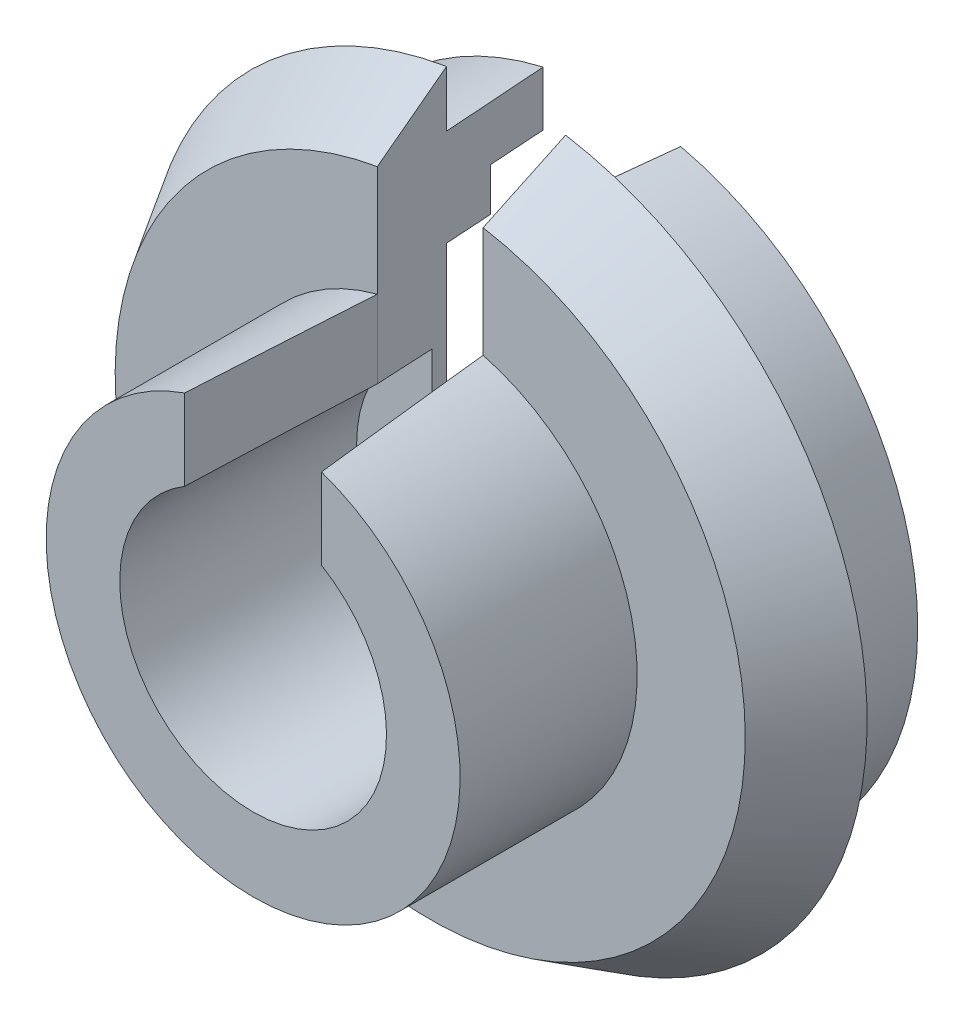
ISO-10303-21;
HEADER;
FILE_DESCRIPTION(('STEP AP214'),'2;1');
FILE_NAME('part.step','',(''),(''),'','','');
FILE_SCHEMA(('AUTOMOTIVE_DESIGN { 1 0 10303 214 1 1 1 1 }'));
ENDSEC;
DATA;
#1=APPLICATION_CONTEXT('core data for automotive mechanical design processes');
#2=APPLICATION_PROTOCOL_DEFINITION('international standard','automotive_design',2000,#1);
#3=PRODUCT_CONTEXT('',#1,'mechanical');
#4=PRODUCT('Part','Part','',(#3));
#5=PRODUCT_RELATED_PRODUCT_CATEGORY('part','',(#4));
#6=PRODUCT_DEFINITION_FORMATION('','',#4);
#7=PRODUCT_DEFINITION_CONTEXT('part definition',#1,'design');
#8=PRODUCT_DEFINITION('design','',#6,#7);
#9=PRODUCT_DEFINITION_SHAPE('','',#8);
#10=(LENGTH_UNIT() NAMED_UNIT(*) SI_UNIT(.MILLI.,.METRE.));
#11=(NAMED_UNIT(*) PLANE_ANGLE_UNIT() SI_UNIT($,.RADIAN.));
#12=(NAMED_UNIT(*) SI_UNIT($,.STERADIAN.) SOLID_ANGLE_UNIT());
#13=UNCERTAINTY_MEASURE_WITH_UNIT(LENGTH_MEASURE(1.E-05),#10,'distance_accuracy_value','');
#14=(GEOMETRIC_REPRESENTATION_CONTEXT(3) GLOBAL_UNCERTAINTY_ASSIGNED_CONTEXT((#13)) GLOBAL_UNIT_ASSIGNED_CONTEXT((#10,
#11,#12)) REPRESENTATION_CONTEXT('',''));
#15=CARTESIAN_POINT('',(0.,0.,0.));
#16=DIRECTION('',(0.,0.,1.));
#17=DIRECTION('',(1.,0.,0.));
#18=AXIS2_PLACEMENT_3D('',#15,#16,#17);
#19=CARTESIAN_POINT('',(0.,0.,-1.65));
#20=DIRECTION('',(0.,0.,-1.));
#21=DIRECTION('',(-1.,0.,0.));
#22=AXIS2_PLACEMENT_3D('',#19,#20,#21);
#23=PLANE('',#22);
#24=CARTESIAN_POINT('',(0.,0.,-1.65));
#25=DIRECTION('',(0.,0.,-1.));
#26=DIRECTION('',(-1.,0.,0.));
#27=AXIS2_PLACEMENT_3D('',#24,#25,#26);
#28=CIRCLE('',#27,4.6);
#29=CARTESIAN_POINT('',(1.29435629481778,4.41414111487904,-1.65));
#30=VERTEX_POINT('',#29);
#31=CARTESIAN_POINT('',(-1.29435629481778,4.41414111487904,-1.65));
#32=VERTEX_POINT('',#31);
#33=EDGE_CURVE('E210',#30,#32,#28,.T.);
#34=ORIENTED_EDGE('',*,*,#33,.T.);
#35=DIRECTION('',(0.,1.,0.));
#36=VECTOR('',#35,1.);
#37=CARTESIAN_POINT('',(-1.29435629481778,0.,-1.65));
#38=LINE('',#37,#36);
#39=CARTESIAN_POINT('',(-1.29435629481778,1.01417424852568,-1.65000000000002));
#40=VERTEX_POINT('',#39);
#41=EDGE_CURVE('E194',#32,#40,#38,.F.);
#42=ORIENTED_EDGE('',*,*,#41,.T.);
#43=CARTESIAN_POINT('',(0.,0.,-1.65));
#44=DIRECTION('',(0.,0.,-1.));
#45=DIRECTION('',(-1.,0.,0.));
#46=AXIS2_PLACEMENT_3D('',#43,#44,#45);
#47=CIRCLE('',#46,1.64435629481778);
#48=CARTESIAN_POINT('',(1.29435629481778,1.01417424852568,-1.65000000000002));
#49=VERTEX_POINT('',#48);
#50=EDGE_CURVE('E214',#49,#40,#47,.T.);
#51=ORIENTED_EDGE('',*,*,#50,.F.);
#52=DIRECTION('',(0.,-1.,0.));
#53=VECTOR('',#52,1.);
#54=CARTESIAN_POINT('',(1.29435629481778,0.,-1.65));
#55=LINE('',#54,#53);
#56=EDGE_CURVE('E163',#49,#30,#55,.F.);
#57=ORIENTED_EDGE('',*,*,#56,.T.);
#58=EDGE_LOOP('',(#34,#42,#51,#57));
#59=FACE_BOUND('',#58,.T.);
#60=ADVANCED_FACE('F39',(#59),#23,.T.);
#61=CARTESIAN_POINT('',(0.,0.,-1.3));
#62=DIRECTION('',(0.,0.,1.));
#63=DIRECTION('',(1.,0.,0.));
#64=AXIS2_PLACEMENT_3D('',#61,#62,#63);
#65=PLANE('',#64);
#66=CARTESIAN_POINT('',(0.,0.,-1.3));
#67=DIRECTION('',(0.,0.,1.));
#68=DIRECTION('',(1.,0.,0.));
#69=AXIS2_PLACEMENT_3D('',#66,#67,#68);
#70=CIRCLE('',#69,1.6137352625837);
#71=CARTESIAN_POINT('',(-1.2637352625837,1.00355103697252,-1.3));
#72=VERTEX_POINT('',#71);
#73=CARTESIAN_POINT('',(1.2637352625837,1.00355103697252,-1.3));
#74=VERTEX_POINT('',#73);
#75=EDGE_CURVE('E11',#72,#74,#70,.T.);
#76=ORIENTED_EDGE('',*,*,#75,.F.);
#77=DIRECTION('',(0.,-1.,0.));
#78=VECTOR('',#77,1.);
#79=CARTESIAN_POINT('',(-1.2637352625837,0.,-1.3));
#80=LINE('',#79,#78);
#81=CARTESIAN_POINT('',(-1.2637352625837,2.61016727167101,-1.3));
#82=VERTEX_POINT('',#81);
#83=EDGE_CURVE('E334',#72,#82,#80,.F.);
#84=ORIENTED_EDGE('',*,*,#83,.T.);
#85=CARTESIAN_POINT('',(0.,0.,-1.3));
#86=DIRECTION('',(0.,0.,-1.));
#87=DIRECTION('',(-1.,0.,0.));
#88=AXIS2_PLACEMENT_3D('',#85,#86,#87);
#89=CIRCLE('',#88,2.9);
#90=CARTESIAN_POINT('',(1.2637352625837,2.61016727167101,-1.3));
#91=VERTEX_POINT('',#90);
#92=EDGE_CURVE('E182',#91,#82,#89,.T.);
#93=ORIENTED_EDGE('',*,*,#92,.F.);
#94=DIRECTION('',(0.,1.,0.));
#95=VECTOR('',#94,1.);
#96=CARTESIAN_POINT('',(1.2637352625837,0.,-1.3));
#97=LINE('',#96,#95);
#98=EDGE_CURVE('E207',#91,#74,#97,.F.);
#99=ORIENTED_EDGE('',*,*,#98,.T.);
#100=EDGE_LOOP('',(#76,#84,#93,#99));
#101=FACE_BOUND('',#100,.T.);
#102=ADVANCED_FACE('F352',(#101),#65,.T.);
#103=CARTESIAN_POINT('',(0.,0.,0.));
#104=DIRECTION('',(0.,0.,-1.));
#105=DIRECTION('',(-1.,0.,0.));
#106=AXIS2_PLACEMENT_3D('',#103,#104,#105);
#107=PLANE('',#106);
#108=DIRECTION('',(0.,1.,0.));
#109=VECTOR('',#108,1.);
#110=CARTESIAN_POINT('',(-1.15,0.,0.));
#111=LINE('',#110,#109);
#112=CARTESIAN_POINT('',(-1.15,4.35057467468379,0.));
#113=VERTEX_POINT('',#112);
#114=CARTESIAN_POINT('',(-1.15,6.75277720645365,0.));
#115=VERTEX_POINT('',#114);
#116=EDGE_CURVE('E168',#113,#115,#111,.T.);
#117=ORIENTED_EDGE('',*,*,#116,.T.);
#118=CARTESIAN_POINT('',(0.,0.,0.));
#119=DIRECTION('',(0.,0.,-1.));
#120=DIRECTION('',(-1.,0.,0.));
#121=AXIS2_PLACEMENT_3D('',#118,#119,#120);
#122=CIRCLE('',#121,6.85);
#123=CARTESIAN_POINT('',(1.15,6.75277720645365,0.));
#124=VERTEX_POINT('',#123);
#125=EDGE_CURVE('E160',#124,#115,#122,.T.);
#126=ORIENTED_EDGE('',*,*,#125,.F.);
#127=DIRECTION('',(0.,-1.,0.));
#128=VECTOR('',#127,1.);
#129=CARTESIAN_POINT('',(1.15,0.,0.));
#130=LINE('',#129,#128);
#131=CARTESIAN_POINT('',(1.15,4.35057467468379,0.));
#132=VERTEX_POINT('',#131);
#133=EDGE_CURVE('E143',#124,#132,#130,.T.);
#134=ORIENTED_EDGE('',*,*,#133,.T.);
#135=CARTESIAN_POINT('',(0.,0.,0.));
#136=DIRECTION('',(0.,0.,-1.));
#137=DIRECTION('',(-1.,0.,0.));
#138=AXIS2_PLACEMENT_3D('',#135,#136,#137);
#139=CIRCLE('',#138,4.5);
#140=EDGE_CURVE('E169',#132,#113,#139,.T.);
#141=ORIENTED_EDGE('',*,*,#140,.T.);
#142=EDGE_LOOP('',(#117,#126,#134,#141));
#143=FACE_BOUND('',#142,.T.);
#144=ADVANCED_FACE('F167',(#143),#107,.F.);
#145=CARTESIAN_POINT('',(0.,0.,0.));
#146=DIRECTION('',(0.,0.,-1.));
#147=DIRECTION('',(-1.,0.,0.));
#148=AXIS2_PLACEMENT_3D('',#145,#146,#147);
#149=CONICAL_SURFACE('',#148,6.85,0.544863915451544);
#150=CARTESIAN_POINT('',(-1.29437379255048,7.74267392637414,-1.6502));
#151=CARTESIAN_POINT('',(-1.2703083581947,7.5776753542657,-1.37513082662473));
#152=CARTESIAN_POINT('',(-1.24624303349325,7.41267467676856,-1.1000629066043));
#153=CARTESIAN_POINT('',(-1.19811260339886,7.08266911099557,-0.549929573270966));
#154=CARTESIAN_POINT('',(-1.17404749800591,6.91766422271971,-0.274864159958059));
#155=CARTESIAN_POINT('',(-1.1499825022673,6.75265722905515,0.00019999999999995));
#156=B_SPLINE_CURVE_WITH_KNOTS('',3,(#150,#151,#152,#153,#154,#155),.UNSPECIFIED.,.F.,.F.,(4,2,
4),(0.,0.964987314148109,1.92997462830385),.UNSPECIFIED.);
#157=CARTESIAN_POINT('',(-1.29435629481778,7.74255395732349,-1.65));
#158=VERTEX_POINT('',#157);
#159=EDGE_CURVE('E235',#158,#115,#156,.T.);
#160=ORIENTED_EDGE('',*,*,#159,.F.);
#161=CARTESIAN_POINT('',(0.,0.,-1.65));
#162=DIRECTION('',(0.,0.,-1.));
#163=DIRECTION('',(-1.,0.,0.));
#164=AXIS2_PLACEMENT_3D('',#161,#162,#163);
#165=CIRCLE('',#164,7.85);
#166=CARTESIAN_POINT('',(1.29435629481778,7.74255395732349,-1.65));
#167=VERTEX_POINT('',#166);
#168=EDGE_CURVE('E162',#167,#158,#165,.T.);
#169=ORIENTED_EDGE('',*,*,#168,.F.);
#170=CARTESIAN_POINT('',(1.1499825022673,6.75265722905515,0.000200000000000124));
#171=CARTESIAN_POINT('',(1.17404749800591,6.91766422271971,-0.274864159958059));
#172=CARTESIAN_POINT('',(1.19811260339886,7.08266911099557,-0.549929573270966));
#173=CARTESIAN_POINT('',(1.24624303349325,7.41267467676856,-1.1000629066043));
#174=CARTESIAN_POINT('',(1.2703083581947,7.5776753542657,-1.37513082662473));
#175=CARTESIAN_POINT('',(1.29437379255048,7.74267392637414,-1.6502));
#176=B_SPLINE_CURVE_WITH_KNOTS('',3,(#170,#171,#172,#173,#174,#175),.UNSPECIFIED.,.F.,.F.,(4,2,
4),(0.,0.964987314155744,1.92997462830385),.UNSPECIFIED.);
#177=EDGE_CURVE('E146',#124,#167,#176,.T.);
#178=ORIENTED_EDGE('',*,*,#177,.F.);
#179=ORIENTED_EDGE('',*,*,#125,.T.);
#180=EDGE_LOOP('',(#160,#169,#178,#179));
#181=FACE_BOUND('',#180,.T.);
#182=ADVANCED_FACE('F159',(#181),#149,.T.);
#183=CARTESIAN_POINT('',(0.,0.,-1.65));
#184=DIRECTION('',(0.,0.,-1.));
#185=DIRECTION('',(-1.,0.,0.));
#186=AXIS2_PLACEMENT_3D('',#183,#184,#185);
#187=PLANE('',#186);
#188=ORIENTED_EDGE('',*,*,#168,.T.);
#189=DIRECTION('',(0.,1.,0.));
#190=VECTOR('',#189,1.);
#191=CARTESIAN_POINT('',(-1.29435629481778,0.,-1.65));
#192=LINE('',#191,#190);
#193=CARTESIAN_POINT('',(-1.29435629481778,6.52281701276876,-1.65));
#194=VERTEX_POINT('',#193);
#195=EDGE_CURVE('E234',#158,#194,#192,.F.);
#196=ORIENTED_EDGE('',*,*,#195,.T.);
#197=CARTESIAN_POINT('',(0.,0.,-1.65));
#198=DIRECTION('',(0.,0.,-1.));
#199=DIRECTION('',(-1.,0.,0.));
#200=AXIS2_PLACEMENT_3D('',#197,#198,#199);
#201=CIRCLE('',#200,6.65);
#202=CARTESIAN_POINT('',(1.29435629481778,6.52281701276876,-1.65));
#203=VERTEX_POINT('',#202);
#204=EDGE_CURVE('E173',#203,#194,#201,.T.);
#205=ORIENTED_EDGE('',*,*,#204,.F.);
#206=DIRECTION('',(0.,-1.,0.));
#207=VECTOR('',#206,1.);
#208=CARTESIAN_POINT('',(1.29435629481778,0.,-1.65));
#209=LINE('',#208,#207);
#210=EDGE_CURVE('E164',#203,#167,#209,.F.);
#211=ORIENTED_EDGE('',*,*,#210,.T.);
#212=EDGE_LOOP('',(#188,#196,#205,#211));
#213=FACE_BOUND('',#212,.T.);
#214=ADVANCED_FACE('F233',(#213),#187,.T.);
#215=CARTESIAN_POINT('',(0.,0.,0.));
#216=DIRECTION('',(0.,0.,-1.));
#217=DIRECTION('',(-1.,0.,0.));
#218=AXIS2_PLACEMENT_3D('',#215,#216,#217);
#219=CYLINDRICAL_SURFACE('',#218,6.65);
#220=CARTESIAN_POINT('',(0.,0.,13.1445601481756));
#221=DIRECTION('',(-0.996194698091746,0.,0.0871557427476584));
#222=DIRECTION('',(-0.0871557427476584,0.,-0.996194698091746));
#223=AXIS2_PLACEMENT_3D('',#220,#221,#222);
#224=ELLIPSE('',#223,76.3001930837045,6.65);
#225=CARTESIAN_POINT('',(-1.4955802209274,6.47964040690305,-3.95));
#226=VERTEX_POINT('',#225);
#227=EDGE_CURVE('E229',#226,#194,#224,.F.);
#228=ORIENTED_EDGE('',*,*,#227,.F.);
#229=CARTESIAN_POINT('',(0.,0.,-3.95));
#230=DIRECTION('',(0.,0.,-1.));
#231=DIRECTION('',(-1.,0.,0.));
#232=AXIS2_PLACEMENT_3D('',#229,#230,#231);
#233=CIRCLE('',#232,6.65);
#234=CARTESIAN_POINT('',(1.4955802209274,6.47964040690305,-3.95));
#235=VERTEX_POINT('',#234);
#236=EDGE_CURVE('E220',#235,#226,#233,.T.);
#237=ORIENTED_EDGE('',*,*,#236,.F.);
#238=CARTESIAN_POINT('',(0.,0.,13.1445601481755));
#239=DIRECTION('',(0.996194698091746,0.,0.0871557427476584));
#240=DIRECTION('',(0.0871557427476584,0.,-0.996194698091746));
#241=AXIS2_PLACEMENT_3D('',#238,#239,#240);
#242=ELLIPSE('',#241,76.3001930837043,6.65);
#243=EDGE_CURVE('E230',#203,#235,#242,.F.);
#244=ORIENTED_EDGE('',*,*,#243,.F.);
#245=ORIENTED_EDGE('',*,*,#204,.T.);
#246=EDGE_LOOP('',(#228,#237,#244,#245));
#247=FACE_BOUND('',#246,.T.);
#248=ADVANCED_FACE('F227',(#247),#219,.T.);
#249=CARTESIAN_POINT('',(0.,0.,-3.95));
#250=DIRECTION('',(0.,0.,-1.));
#251=DIRECTION('',(-1.,0.,0.));
#252=AXIS2_PLACEMENT_3D('',#249,#250,#251);
#253=PLANE('',#252);
#254=ORIENTED_EDGE('',*,*,#236,.T.);
#255=DIRECTION('',(0.,1.,0.));
#256=VECTOR('',#255,1.);
#257=CARTESIAN_POINT('',(-1.4955802209274,0.,-3.95));
#258=LINE('',#257,#256);
#259=CARTESIAN_POINT('',(-1.4955802209274,5.29275351804434,-3.95));
#260=VERTEX_POINT('',#259);
#261=EDGE_CURVE('E238',#226,#260,#258,.F.);
#262=ORIENTED_EDGE('',*,*,#261,.T.);
#263=CARTESIAN_POINT('',(0.,0.,-3.95));
#264=DIRECTION('',(0.,0.,-1.));
#265=DIRECTION('',(-1.,0.,0.));
#266=AXIS2_PLACEMENT_3D('',#263,#264,#265);
#267=CIRCLE('',#266,5.5);
#268=CARTESIAN_POINT('',(1.4955802209274,5.29275351804434,-3.95));
#269=VERTEX_POINT('',#268);
#270=EDGE_CURVE('E212',#269,#260,#267,.T.);
#271=ORIENTED_EDGE('',*,*,#270,.F.);
#272=DIRECTION('',(0.,-1.,0.));
#273=VECTOR('',#272,1.);
#274=CARTESIAN_POINT('',(1.4955802209274,0.,-3.95));
#275=LINE('',#274,#273);
#276=EDGE_CURVE('E304',#269,#235,#275,.F.);
#277=ORIENTED_EDGE('',*,*,#276,.T.);
#278=EDGE_LOOP('',(#254,#262,#271,#277));
#279=FACE_BOUND('',#278,.T.);
#280=ADVANCED_FACE('F298',(#279),#253,.T.);
#281=CARTESIAN_POINT('',(0.,0.,0.));
#282=DIRECTION('',(0.,0.,-1.));
#283=DIRECTION('',(-1.,0.,0.));
#284=AXIS2_PLACEMENT_3D('',#281,#282,#283);
#285=CYLINDRICAL_SURFACE('',#284,5.5);
#286=CARTESIAN_POINT('',(0.,0.,13.1445601481756));
#287=DIRECTION('',(-0.996194698091746,0.,0.0871557427476584));
#288=DIRECTION('',(-0.0871557427476584,0.,-0.996194698091746));
#289=AXIS2_PLACEMENT_3D('',#286,#287,#288);
#290=ELLIPSE('',#289,63.1054228511842,5.5);
#291=CARTESIAN_POINT('',(-1.38621939152,5.32244265338518,-2.7));
#292=VERTEX_POINT('',#291);
#293=EDGE_CURVE('E206',#292,#260,#290,.T.);
#294=ORIENTED_EDGE('',*,*,#293,.F.);
#295=CARTESIAN_POINT('',(0.,0.,-2.7));
#296=DIRECTION('',(0.,0.,-1.));
#297=DIRECTION('',(-1.,0.,0.));
#298=AXIS2_PLACEMENT_3D('',#295,#296,#297);
#299=CIRCLE('',#298,5.5);
#300=CARTESIAN_POINT('',(1.38621939152,5.32244265338518,-2.7));
#301=VERTEX_POINT('',#300);
#302=EDGE_CURVE('E205',#301,#292,#299,.T.);
#303=ORIENTED_EDGE('',*,*,#302,.F.);
#304=CARTESIAN_POINT('',(0.,0.,13.1445601481755));
#305=DIRECTION('',(0.996194698091746,0.,0.0871557427476584));
#306=DIRECTION('',(0.0871557427476584,0.,-0.996194698091746));
#307=AXIS2_PLACEMENT_3D('',#304,#305,#306);
#308=ELLIPSE('',#307,63.105422851184,5.5);
#309=EDGE_CURVE('E303',#269,#301,#308,.T.);
#310=ORIENTED_EDGE('',*,*,#309,.F.);
#311=ORIENTED_EDGE('',*,*,#270,.T.);
#312=EDGE_LOOP('',(#294,#303,#310,#311));
#313=FACE_BOUND('',#312,.T.);
#314=ADVANCED_FACE('F302',(#313),#285,.F.);
#315=CARTESIAN_POINT('',(0.,0.,-2.7));
#316=DIRECTION('',(0.,0.,1.));
#317=DIRECTION('',(1.,0.,0.));
#318=AXIS2_PLACEMENT_3D('',#315,#316,#317);
#319=PLANE('',#318);
#320=DIRECTION('',(0.,-1.,0.));
#321=VECTOR('',#320,1.);
#322=CARTESIAN_POINT('',(-1.38621939152,0.,-2.7));
#323=LINE('',#322,#321);
#324=CARTESIAN_POINT('',(-1.38621939152,4.38615957285801,-2.7));
#325=VERTEX_POINT('',#324);
#326=EDGE_CURVE('E191',#325,#292,#323,.F.);
#327=ORIENTED_EDGE('',*,*,#326,.F.);
#328=CARTESIAN_POINT('',(0.,0.,-2.7));
#329=DIRECTION('',(0.,0.,-1.));
#330=DIRECTION('',(-1.,0.,0.));
#331=AXIS2_PLACEMENT_3D('',#328,#329,#330);
#332=CIRCLE('',#331,4.6);
#333=CARTESIAN_POINT('',(1.38621939152,4.38615957285801,-2.7));
#334=VERTEX_POINT('',#333);
#335=EDGE_CURVE('E203',#334,#325,#332,.T.);
#336=ORIENTED_EDGE('',*,*,#335,.F.);
#337=DIRECTION('',(0.,1.,0.));
#338=VECTOR('',#337,1.);
#339=CARTESIAN_POINT('',(1.38621939152,0.,-2.7));
#340=LINE('',#339,#338);
#341=EDGE_CURVE('E53',#301,#334,#340,.F.);
#342=ORIENTED_EDGE('',*,*,#341,.F.);
#343=ORIENTED_EDGE('',*,*,#302,.T.);
#344=EDGE_LOOP('',(#327,#336,#342,#343));
#345=FACE_BOUND('',#344,.T.);
#346=ADVANCED_FACE('F202',(#345),#319,.F.);
#347=CARTESIAN_POINT('',(0.,0.,0.));
#348=DIRECTION('',(0.,0.,-1.));
#349=DIRECTION('',(-1.,0.,0.));
#350=AXIS2_PLACEMENT_3D('',#347,#348,#349);
#351=CYLINDRICAL_SURFACE('',#350,4.6);
#352=CARTESIAN_POINT('',(0.,0.,13.1445601481756));
#353=DIRECTION('',(-0.996194698091746,0.,0.0871557427476584));
#354=DIRECTION('',(-0.0871557427476584,0.,-0.996194698091746));
#355=AXIS2_PLACEMENT_3D('',#352,#353,#354);
#356=ELLIPSE('',#355,52.7790809300813,4.6);
#357=EDGE_CURVE('E46',#32,#325,#356,.T.);
#358=ORIENTED_EDGE('',*,*,#357,.F.);
#359=ORIENTED_EDGE('',*,*,#33,.F.);
#360=CARTESIAN_POINT('',(0.,0.,13.1445601481755));
#361=DIRECTION('',(0.996194698091746,0.,0.0871557427476584));
#362=DIRECTION('',(0.0871557427476584,0.,-0.996194698091746));
#363=AXIS2_PLACEMENT_3D('',#360,#361,#362);
#364=ELLIPSE('',#363,52.7790809300811,4.6);
#365=EDGE_CURVE('E185',#334,#30,#364,.T.);
#366=ORIENTED_EDGE('',*,*,#365,.F.);
#367=ORIENTED_EDGE('',*,*,#335,.T.);
#368=EDGE_LOOP('',(#358,#359,#366,#367));
#369=FACE_BOUND('',#368,.T.);
#370=ADVANCED_FACE('F209',(#369),#351,.F.);
#371=CARTESIAN_POINT('',(0.,0.,0.));
#372=DIRECTION('',(0.,0.,-1.));
#373=DIRECTION('',(-1.,0.,0.));
#374=AXIS2_PLACEMENT_3D('',#371,#372,#373);
#375=CYLINDRICAL_SURFACE('',#374,2.9);
#376=CARTESIAN_POINT('',(0.,0.,-13.1445601481755));
#377=DIRECTION('',(-0.996194698091746,0.,-0.0871557427476584));
#378=DIRECTION('',(0.0871557427476584,0.,-0.996194698091746));
#379=AXIS2_PLACEMENT_3D('',#376,#377,#378);
#380=ELLIPSE('',#379,33.2737684124425,2.9);
#381=CARTESIAN_POINT('',(-1.48683135457481,2.48984588339384,3.85));
#382=VERTEX_POINT('',#381);
#383=CARTESIAN_POINT('',(-1.15,2.66223590239483,0.));
#384=VERTEX_POINT('',#383);
#385=EDGE_CURVE('E315',#382,#384,#380,.T.);
#386=ORIENTED_EDGE('',*,*,#385,.F.);
#387=CARTESIAN_POINT('',(0.,0.,3.85));
#388=DIRECTION('',(0.,0.,-1.));
#389=DIRECTION('',(-1.,0.,0.));
#390=AXIS2_PLACEMENT_3D('',#387,#388,#389);
#391=CIRCLE('',#390,2.9);
#392=CARTESIAN_POINT('',(1.48683135457481,2.48984588339384,3.85));
#393=VERTEX_POINT('',#392);
#394=EDGE_CURVE('E179',#393,#382,#391,.T.);
#395=ORIENTED_EDGE('',*,*,#394,.F.);
#396=CARTESIAN_POINT('',(0.,0.,-13.1445601481756));
#397=DIRECTION('',(0.996194698091746,0.,-0.0871557427476584));
#398=DIRECTION('',(-0.0871557427476584,0.,-0.996194698091746));
#399=AXIS2_PLACEMENT_3D('',#396,#397,#398);
#400=ELLIPSE('',#399,33.2737684124426,2.9);
#401=CARTESIAN_POINT('',(1.15,2.66223590239483,0.));
#402=VERTEX_POINT('',#401);
#403=EDGE_CURVE('E321',#402,#393,#400,.T.);
#404=ORIENTED_EDGE('',*,*,#403,.F.);
#405=CARTESIAN_POINT('',(0.,0.,13.1445601481755));
#406=DIRECTION('',(0.996194698091746,0.,0.0871557427476584));
#407=DIRECTION('',(0.0871557427476584,0.,-0.996194698091746));
#408=AXIS2_PLACEMENT_3D('',#405,#406,#407);
#409=ELLIPSE('',#408,33.2737684124425,2.9);
#410=EDGE_CURVE('E290',#402,#91,#409,.F.);
#411=ORIENTED_EDGE('',*,*,#410,.T.);
#412=ORIENTED_EDGE('',*,*,#92,.T.);
#413=CARTESIAN_POINT('',(0.,0.,13.1445601481756));
#414=DIRECTION('',(-0.996194698091746,0.,0.0871557427476584));
#415=DIRECTION('',(-0.0871557427476584,0.,-0.996194698091746));
#416=AXIS2_PLACEMENT_3D('',#413,#414,#415);
#417=ELLIPSE('',#416,33.2737684124426,2.9);
#418=EDGE_CURVE('E335',#82,#384,#417,.F.);
#419=ORIENTED_EDGE('',*,*,#418,.T.);
#420=EDGE_LOOP('',(#386,#395,#404,#411,#412,#419));
#421=FACE_BOUND('',#420,.T.);
#422=ADVANCED_FACE('F344',(#421),#375,.F.);
#423=CARTESIAN_POINT('',(0.,0.,3.85));
#424=DIRECTION('',(0.,0.,-1.));
#425=DIRECTION('',(-1.,0.,0.));
#426=AXIS2_PLACEMENT_3D('',#423,#424,#425);
#427=PLANE('',#426);
#428=ORIENTED_EDGE('',*,*,#394,.T.);
#429=DIRECTION('',(0.,1.,0.));
#430=VECTOR('',#429,1.);
#431=CARTESIAN_POINT('',(-1.48683135457481,0.,3.85));
#432=LINE('',#431,#430);
#433=CARTESIAN_POINT('',(-1.48683135457481,4.2472735399375,3.85));
#434=VERTEX_POINT('',#433);
#435=EDGE_CURVE('E61',#382,#434,#432,.T.);
#436=ORIENTED_EDGE('',*,*,#435,.T.);
#437=CARTESIAN_POINT('',(0.,0.,3.85));
#438=DIRECTION('',(0.,0.,-1.));
#439=DIRECTION('',(-1.,0.,0.));
#440=AXIS2_PLACEMENT_3D('',#437,#438,#439);
#441=CIRCLE('',#440,4.5);
#442=CARTESIAN_POINT('',(1.48683135457481,4.2472735399375,3.85));
#443=VERTEX_POINT('',#442);
#444=EDGE_CURVE('E171',#443,#434,#441,.T.);
#445=ORIENTED_EDGE('',*,*,#444,.F.);
#446=DIRECTION('',(0.,-1.,0.));
#447=VECTOR('',#446,1.);
#448=CARTESIAN_POINT('',(1.48683135457481,0.,3.85));
#449=LINE('',#448,#447);
#450=EDGE_CURVE('E324',#443,#393,#449,.T.);
#451=ORIENTED_EDGE('',*,*,#450,.T.);
#452=EDGE_LOOP('',(#428,#436,#445,#451));
#453=FACE_BOUND('',#452,.T.);
#454=ADVANCED_FACE('F343',(#453),#427,.F.);
#455=CARTESIAN_POINT('',(0.,0.,0.));
#456=DIRECTION('',(0.,0.,-1.));
#457=DIRECTION('',(-1.,0.,0.));
#458=AXIS2_PLACEMENT_3D('',#455,#456,#457);
#459=CYLINDRICAL_SURFACE('',#458,4.5);
#460=CARTESIAN_POINT('',(0.,0.,-13.1445601481755));
#461=DIRECTION('',(-0.996194698091746,0.,-0.0871557427476584));
#462=DIRECTION('',(0.0871557427476584,0.,-0.996194698091746));
#463=AXIS2_PLACEMENT_3D('',#460,#461,#462);
#464=ELLIPSE('',#463,51.6317096055142,4.5);
#465=EDGE_CURVE('E314',#113,#434,#464,.F.);
#466=ORIENTED_EDGE('',*,*,#465,.F.);
#467=ORIENTED_EDGE('',*,*,#140,.F.);
#468=CARTESIAN_POINT('',(0.,0.,-13.1445601481756));
#469=DIRECTION('',(0.996194698091746,0.,-0.0871557427476584));
#470=DIRECTION('',(-0.0871557427476584,0.,-0.996194698091746));
#471=AXIS2_PLACEMENT_3D('',#468,#469,#470);
#472=ELLIPSE('',#471,51.6317096055143,4.5);
#473=EDGE_CURVE('E337',#443,#132,#472,.F.);
#474=ORIENTED_EDGE('',*,*,#473,.F.);
#475=ORIENTED_EDGE('',*,*,#444,.T.);
#476=EDGE_LOOP('',(#466,#467,#474,#475));
#477=FACE_BOUND('',#476,.T.);
#478=ADVANCED_FACE('F318',(#477),#459,.T.);
#479=CARTESIAN_POINT('',(-1.15,0.,0.));
#480=DIRECTION('',(-0.996194698091746,0.,-0.0871557427476584));
#481=DIRECTION('',(-0.0871557427476584,0.,0.996194698091746));
#482=AXIS2_PLACEMENT_3D('',#479,#480,#481);
#483=PLANE('',#482);
#484=ORIENTED_EDGE('',*,*,#385,.T.);
#485=EDGE_CURVE('E308',#384,#113,#111,.T.);
#486=ORIENTED_EDGE('',*,*,#485,.T.);
#487=ORIENTED_EDGE('',*,*,#465,.T.);
#488=ORIENTED_EDGE('',*,*,#435,.F.);
#489=EDGE_LOOP('',(#484,#486,#487,#488));
#490=FACE_BOUND('',#489,.T.);
#491=ADVANCED_FACE('F278',(#490),#483,.F.);
#492=CARTESIAN_POINT('',(1.15,0.,0.));
#493=DIRECTION('',(0.996194698091746,0.,-0.0871557427476584));
#494=DIRECTION('',(-0.0871557427476584,0.,-0.996194698091746));
#495=AXIS2_PLACEMENT_3D('',#492,#493,#494);
#496=PLANE('',#495);
#497=ORIENTED_EDGE('',*,*,#403,.T.);
#498=ORIENTED_EDGE('',*,*,#450,.F.);
#499=ORIENTED_EDGE('',*,*,#473,.T.);
#500=EDGE_CURVE('E149',#132,#402,#130,.T.);
#501=ORIENTED_EDGE('',*,*,#500,.T.);
#502=EDGE_LOOP('',(#497,#498,#499,#501));
#503=FACE_BOUND('',#502,.T.);
#504=ADVANCED_FACE('F255',(#503),#496,.F.);
#505=CARTESIAN_POINT('',(-1.15,0.,0.));
#506=DIRECTION('',(-0.996194698091746,0.,0.0871557427476584));
#507=DIRECTION('',(0.0871557427476584,0.,0.996194698091746));
#508=AXIS2_PLACEMENT_3D('',#505,#506,#507);
#509=PLANE('',#508);
#510=CARTESIAN_POINT('',(-2.02488663525924,1.24093539101819,-10.));
#511=CARTESIAN_POINT('',(-1.96144189968459,1.22303807595889,-9.27482335404685));
#512=CARTESIAN_POINT('',(-1.89799797261102,1.20476066805186,-8.54965594930337));
#513=CARTESIAN_POINT('',(-1.77111227403723,1.16731739670558,-7.0993457781326));
#514=CARTESIAN_POINT('',(-1.70767050253194,1.14815153553019,-6.37420301164726));
#515=CARTESIAN_POINT('',(-1.56185338247079,1.10293055959556,-4.70750570271026));
#516=CARTESIAN_POINT('',(-1.47947884717936,1.07652664742365,-3.76596045591355));
#517=CARTESIAN_POINT('',(-1.31473503100395,1.02154375876679,-1.88293002047214));
#518=CARTESIAN_POINT('',(-1.23236575013843,0.992964775021341,-0.941444832038397));
#519=CARTESIAN_POINT('',(-1.15,0.96306801421291,0.));
#520=B_SPLINE_CURVE_WITH_KNOTS('',3,(#510,#511,#512,#513,#514,#515,#516,#517,#518,#519),
.UNSPECIFIED.,.F.,.F.,(4,2,2,2,4),(0.,2.18449999761625,4.36899442920517,7.2055237055754,
10.0420624508459),.UNSPECIFIED.);
#521=EDGE_CURVE('E261',#40,#72,#520,.T.);
#522=ORIENTED_EDGE('',*,*,#521,.F.);
#523=ORIENTED_EDGE('',*,*,#41,.F.);
#524=ORIENTED_EDGE('',*,*,#357,.T.);
#525=ORIENTED_EDGE('',*,*,#326,.T.);
#526=ORIENTED_EDGE('',*,*,#293,.T.);
#527=ORIENTED_EDGE('',*,*,#261,.F.);
#528=ORIENTED_EDGE('',*,*,#227,.T.);
#529=ORIENTED_EDGE('',*,*,#195,.F.);
#530=ORIENTED_EDGE('',*,*,#159,.T.);
#531=ORIENTED_EDGE('',*,*,#116,.F.);
#532=ORIENTED_EDGE('',*,*,#485,.F.);
#533=ORIENTED_EDGE('',*,*,#418,.F.);
#534=ORIENTED_EDGE('',*,*,#83,.F.);
#535=EDGE_LOOP('',(#522,#523,#524,#525,#526,#527,#528,#529,#530,#531,#532,#533,#534));
#536=FACE_BOUND('',#535,.T.);
#537=ADVANCED_FACE('F190',(#536),#509,.F.);
#538=CARTESIAN_POINT('',(1.15,0.,0.));
#539=DIRECTION('',(0.996194698091746,0.,0.0871557427476584));
#540=DIRECTION('',(0.0871557427476584,0.,-0.996194698091746));
#541=AXIS2_PLACEMENT_3D('',#538,#539,#540);
#542=PLANE('',#541);
#543=ORIENTED_EDGE('',*,*,#410,.F.);
#544=ORIENTED_EDGE('',*,*,#500,.F.);
#545=ORIENTED_EDGE('',*,*,#133,.F.);
#546=ORIENTED_EDGE('',*,*,#177,.T.);
#547=ORIENTED_EDGE('',*,*,#210,.F.);
#548=ORIENTED_EDGE('',*,*,#243,.T.);
#549=ORIENTED_EDGE('',*,*,#276,.F.);
#550=ORIENTED_EDGE('',*,*,#309,.T.);
#551=ORIENTED_EDGE('',*,*,#341,.T.);
#552=ORIENTED_EDGE('',*,*,#365,.T.);
#553=ORIENTED_EDGE('',*,*,#56,.F.);
#554=CARTESIAN_POINT('',(2.02488663525924,1.24093539101819,-10.));
#555=CARTESIAN_POINT('',(1.96144189968459,1.22303807595889,-9.27482335404685));
#556=CARTESIAN_POINT('',(1.89799797261102,1.20476066805186,-8.54965594930337));
#557=CARTESIAN_POINT('',(1.77111227403723,1.16731739670558,-7.0993457781326));
#558=CARTESIAN_POINT('',(1.70767050253194,1.14815153553019,-6.37420301164726));
#559=CARTESIAN_POINT('',(1.56185338247079,1.10293055959556,-4.70750570271026));
#560=CARTESIAN_POINT('',(1.47947884717936,1.07652664742365,-3.76596045591355));
#561=CARTESIAN_POINT('',(1.31473503100395,1.02154375876679,-1.88293002047214));
#562=CARTESIAN_POINT('',(1.23236575013843,0.992964775021341,-0.941444832038397));
#563=CARTESIAN_POINT('',(1.15,0.96306801421291,0.));
#564=B_SPLINE_CURVE_WITH_KNOTS('',3,(#554,#555,#556,#557,#558,#559,#560,#561,#562,#563),
.UNSPECIFIED.,.F.,.F.,(4,2,2,2,4),(0.,2.18449999761625,4.36899442920517,7.2055237055754,
10.0420624508459),.UNSPECIFIED.);
#565=EDGE_CURVE('E268',#49,#74,#564,.T.);
#566=ORIENTED_EDGE('',*,*,#565,.T.);
#567=ORIENTED_EDGE('',*,*,#98,.F.);
#568=EDGE_LOOP('',(#543,#544,#545,#546,#547,#548,#549,#550,#551,#552,#553,#566,#567));
#569=FACE_BOUND('',#568,.T.);
#570=ADVANCED_FACE('F145',(#569),#542,.F.);
#571=CARTESIAN_POINT('',(0.,0.,0.));
#572=DIRECTION('',(0.,0.,-1.));
#573=DIRECTION('',(1.,0.,0.));
#574=AXIS2_PLACEMENT_3D('',#571,#572,#573);
#575=CONICAL_SURFACE('',#574,1.5,0.0872664625997167);
#576=ORIENTED_EDGE('',*,*,#50,.T.);
#577=ORIENTED_EDGE('',*,*,#521,.T.);
#578=ORIENTED_EDGE('',*,*,#75,.T.);
#579=ORIENTED_EDGE('',*,*,#565,.F.);
#580=EDGE_LOOP('',(#576,#577,#578,#579));
#581=FACE_BOUND('',#580,.T.);
#582=ADVANCED_FACE('F256',(#581),#575,.F.);
#583=CLOSED_SHELL('',(#60,#102,#144,#182,#214,#248,#280,#314,#346,#370,#422,#454,#478,#491,#504,
#537,#570,#582));
#584=MANIFOLD_SOLID_BREP('B2',#583);
#585=ADVANCED_BREP_SHAPE_REPRESENTATION('',(#18,#584),#14);
#586=SHAPE_DEFINITION_REPRESENTATION(#9,#585);
ENDSEC;
END-ISO-10303-21;
